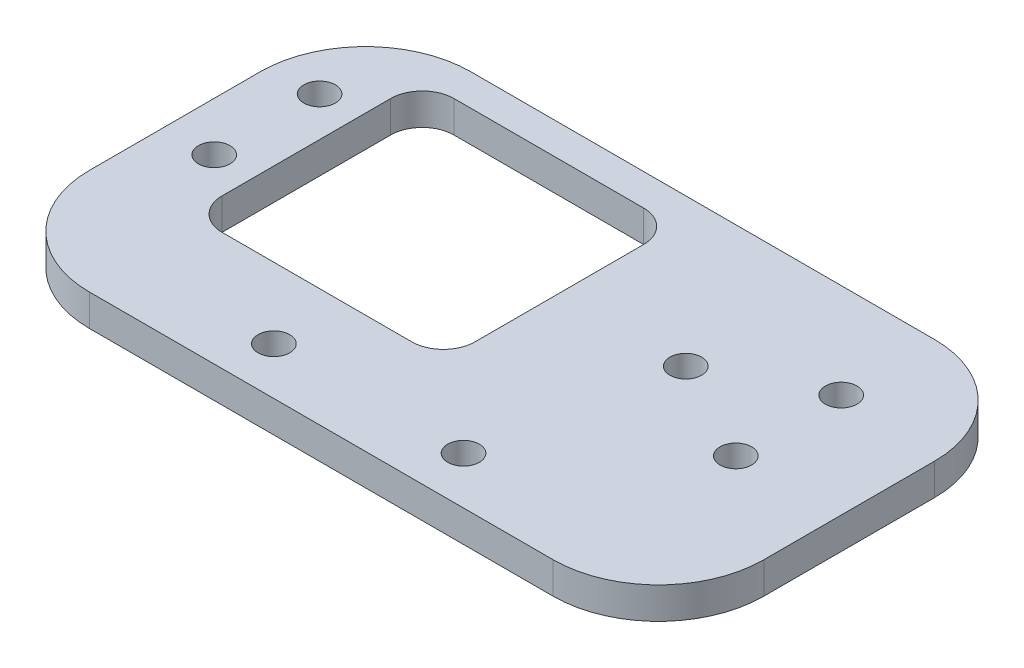
ISO-10303-21;
HEADER;
FILE_DESCRIPTION(('STEP AP214'),'2;1');
FILE_NAME('part.step','',(''),(''),'','','');
FILE_SCHEMA(('AUTOMOTIVE_DESIGN { 1 0 10303 214 1 1 1 1 }'));
ENDSEC;
DATA;
#1=APPLICATION_CONTEXT('core data for automotive mechanical design processes');
#2=APPLICATION_PROTOCOL_DEFINITION('international standard','automotive_design',2000,#1);
#3=PRODUCT_CONTEXT('',#1,'mechanical');
#4=PRODUCT('Part','Part','',(#3));
#5=PRODUCT_RELATED_PRODUCT_CATEGORY('part','',(#4));
#6=PRODUCT_DEFINITION_FORMATION('','',#4);
#7=PRODUCT_DEFINITION_CONTEXT('part definition',#1,'design');
#8=PRODUCT_DEFINITION('design','',#6,#7);
#9=PRODUCT_DEFINITION_SHAPE('','',#8);
#10=(LENGTH_UNIT() NAMED_UNIT(*) SI_UNIT(.MILLI.,.METRE.));
#11=(NAMED_UNIT(*) PLANE_ANGLE_UNIT() SI_UNIT($,.RADIAN.));
#12=(NAMED_UNIT(*) SI_UNIT($,.STERADIAN.) SOLID_ANGLE_UNIT());
#13=UNCERTAINTY_MEASURE_WITH_UNIT(LENGTH_MEASURE(1.E-05),#10,'distance_accuracy_value','');
#14=(GEOMETRIC_REPRESENTATION_CONTEXT(3) GLOBAL_UNCERTAINTY_ASSIGNED_CONTEXT((#13)) GLOBAL_UNIT_ASSIGNED_CONTEXT((#10,
#11,#12)) REPRESENTATION_CONTEXT('',''));
#15=CARTESIAN_POINT('',(0.,0.,0.));
#16=DIRECTION('',(0.,0.,1.));
#17=DIRECTION('',(1.,0.,0.));
#18=AXIS2_PLACEMENT_3D('',#15,#16,#17);
#19=CARTESIAN_POINT('',(0.,3.,0.));
#20=DIRECTION('',(0.,-1.,0.));
#21=DIRECTION('',(0.,0.,-1.));
#22=AXIS2_PLACEMENT_3D('',#19,#20,#21);
#23=PLANE('',#22);
#24=CARTESIAN_POINT('',(12.39,3.,-4.10000000000002));
#25=DIRECTION('',(0.,1.,0.));
#26=DIRECTION('',(0.,0.,1.));
#27=AXIS2_PLACEMENT_3D('',#24,#25,#26);
#28=CIRCLE('',#27,1.5);
#29=CARTESIAN_POINT('',(12.39,3.,-2.60000000000002));
#30=VERTEX_POINT('',#29);
#31=EDGE_CURVE('E398',#30,#30,#28,.T.);
#32=ORIENTED_EDGE('',*,*,#31,.F.);
#33=EDGE_LOOP('',(#32));
#34=FACE_BOUND('',#33,.T.);
#35=DIRECTION('',(-1.,0.,0.));
#36=VECTOR('',#35,1.);
#37=CARTESIAN_POINT('',(-23.61,3.,-15.1));
#38=LINE('',#37,#36);
#39=CARTESIAN_POINT('',(-2.60999999999999,3.,-15.1));
#40=VERTEX_POINT('',#39);
#41=CARTESIAN_POINT('',(-20.61,3.,-15.1));
#42=VERTEX_POINT('',#41);
#43=EDGE_CURVE('E264',#40,#42,#38,.T.);
#44=ORIENTED_EDGE('',*,*,#43,.F.);
#45=CARTESIAN_POINT('',(-2.60999999999998,3.,-12.1));
#46=DIRECTION('',(0.,-1.,0.));
#47=DIRECTION('',(0.,0.,-1.));
#48=AXIS2_PLACEMENT_3D('',#45,#46,#47);
#49=CIRCLE('',#48,3.);
#50=CARTESIAN_POINT('',(0.390000000000019,3.,-12.1));
#51=VERTEX_POINT('',#50);
#52=EDGE_CURVE('E241',#40,#51,#49,.T.);
#53=ORIENTED_EDGE('',*,*,#52,.T.);
#54=DIRECTION('',(0.,0.,1.));
#55=VECTOR('',#54,1.);
#56=CARTESIAN_POINT('',(0.390000000000019,3.,-15.1));
#57=LINE('',#56,#55);
#58=CARTESIAN_POINT('',(0.390000000000021,3.,3.9));
#59=VERTEX_POINT('',#58);
#60=EDGE_CURVE('E387',#51,#59,#57,.T.);
#61=ORIENTED_EDGE('',*,*,#60,.T.);
#62=CARTESIAN_POINT('',(-2.60999999999998,3.,3.9));
#63=DIRECTION('',(0.,-1.,0.));
#64=DIRECTION('',(0.,0.,-1.));
#65=AXIS2_PLACEMENT_3D('',#62,#63,#64);
#66=CIRCLE('',#65,3.);
#67=CARTESIAN_POINT('',(-2.60999999999999,3.,6.9));
#68=VERTEX_POINT('',#67);
#69=EDGE_CURVE('E237',#59,#68,#66,.T.);
#70=ORIENTED_EDGE('',*,*,#69,.T.);
#71=DIRECTION('',(1.,0.,0.));
#72=VECTOR('',#71,1.);
#73=CARTESIAN_POINT('',(-23.61,3.,6.9));
#74=LINE('',#73,#72);
#75=CARTESIAN_POINT('',(-20.61,3.,6.9));
#76=VERTEX_POINT('',#75);
#77=EDGE_CURVE('E269',#76,#68,#74,.T.);
#78=ORIENTED_EDGE('',*,*,#77,.F.);
#79=CARTESIAN_POINT('',(-20.61,3.,3.89999999999999));
#80=DIRECTION('',(0.,-1.,0.));
#81=DIRECTION('',(0.,0.,-1.));
#82=AXIS2_PLACEMENT_3D('',#79,#80,#81);
#83=CIRCLE('',#82,3.);
#84=CARTESIAN_POINT('',(-23.61,3.,3.89999999999999));
#85=VERTEX_POINT('',#84);
#86=EDGE_CURVE('E11',#76,#85,#83,.T.);
#87=ORIENTED_EDGE('',*,*,#86,.T.);
#88=DIRECTION('',(0.,0.,1.));
#89=VECTOR('',#88,1.);
#90=CARTESIAN_POINT('',(-23.61,3.,6.9));
#91=LINE('',#90,#89);
#92=CARTESIAN_POINT('',(-23.61,3.,-12.1));
#93=VERTEX_POINT('',#92);
#94=EDGE_CURVE('E267',#93,#85,#91,.T.);
#95=ORIENTED_EDGE('',*,*,#94,.F.);
#96=CARTESIAN_POINT('',(-20.61,3.,-12.1));
#97=DIRECTION('',(0.,-1.,0.));
#98=DIRECTION('',(0.,0.,-1.));
#99=AXIS2_PLACEMENT_3D('',#96,#97,#98);
#100=CIRCLE('',#99,3.);
#101=EDGE_CURVE('E247',#93,#42,#100,.T.);
#102=ORIENTED_EDGE('',*,*,#101,.T.);
#103=EDGE_LOOP('',(#44,#53,#61,#70,#78,#87,#95,#102));
#104=FACE_BOUND('',#103,.T.);
#105=CARTESIAN_POINT('',(-8.99999999999998,3.,13.6));
#106=DIRECTION('',(0.,1.,0.));
#107=DIRECTION('',(0.,0.,-1.));
#108=AXIS2_PLACEMENT_3D('',#105,#106,#107);
#109=CIRCLE('',#108,1.5);
#110=CARTESIAN_POINT('',(-8.99999999999998,3.,12.1));
#111=VERTEX_POINT('',#110);
#112=EDGE_CURVE('E282',#111,#111,#109,.T.);
#113=ORIENTED_EDGE('',*,*,#112,.F.);
#114=EDGE_LOOP('',(#113));
#115=FACE_BOUND('',#114,.T.);
#116=CARTESIAN_POINT('',(9.00000000000002,3.,13.6));
#117=DIRECTION('',(0.,1.,0.));
#118=DIRECTION('',(0.,0.,1.));
#119=AXIS2_PLACEMENT_3D('',#116,#117,#118);
#120=CIRCLE('',#119,1.5);
#121=CARTESIAN_POINT('',(9.00000000000002,3.,15.1));
#122=VERTEX_POINT('',#121);
#123=EDGE_CURVE('E288',#122,#122,#120,.T.);
#124=ORIENTED_EDGE('',*,*,#123,.F.);
#125=EDGE_LOOP('',(#124));
#126=FACE_BOUND('',#125,.T.);
#127=DIRECTION('',(-1.,0.,0.));
#128=VECTOR('',#127,1.);
#129=CARTESIAN_POINT('',(-32.,3.,-18.1));
#130=LINE('',#129,#128);
#131=CARTESIAN_POINT('',(22.,3.,-18.1));
#132=VERTEX_POINT('',#131);
#133=CARTESIAN_POINT('',(-22.,3.,-18.1));
#134=VERTEX_POINT('',#133);
#135=EDGE_CURVE('E295',#132,#134,#130,.T.);
#136=ORIENTED_EDGE('',*,*,#135,.T.);
#137=CARTESIAN_POINT('',(-22.,3.,-8.1));
#138=DIRECTION('',(0.,-1.,0.));
#139=DIRECTION('',(0.,0.,-1.));
#140=AXIS2_PLACEMENT_3D('',#137,#138,#139);
#141=CIRCLE('',#140,10.);
#142=CARTESIAN_POINT('',(-32.,3.,-8.1));
#143=VERTEX_POINT('',#142);
#144=EDGE_CURVE('E206',#134,#143,#141,.F.);
#145=ORIENTED_EDGE('',*,*,#144,.T.);
#146=DIRECTION('',(0.,0.,1.));
#147=VECTOR('',#146,1.);
#148=CARTESIAN_POINT('',(-32.,3.,18.1));
#149=LINE('',#148,#147);
#150=CARTESIAN_POINT('',(-32.,3.,8.1));
#151=VERTEX_POINT('',#150);
#152=EDGE_CURVE('E174',#143,#151,#149,.T.);
#153=ORIENTED_EDGE('',*,*,#152,.T.);
#154=CARTESIAN_POINT('',(-22.,3.,8.1));
#155=DIRECTION('',(0.,-1.,0.));
#156=DIRECTION('',(0.,0.,-1.));
#157=AXIS2_PLACEMENT_3D('',#154,#155,#156);
#158=CIRCLE('',#157,10.);
#159=CARTESIAN_POINT('',(-22.,3.,18.1));
#160=VERTEX_POINT('',#159);
#161=EDGE_CURVE('E200',#151,#160,#158,.F.);
#162=ORIENTED_EDGE('',*,*,#161,.T.);
#163=DIRECTION('',(1.,0.,0.));
#164=VECTOR('',#163,1.);
#165=CARTESIAN_POINT('',(-32.,3.,18.1));
#166=LINE('',#165,#164);
#167=CARTESIAN_POINT('',(22.,3.,18.1));
#168=VERTEX_POINT('',#167);
#169=EDGE_CURVE('E191',#160,#168,#166,.T.);
#170=ORIENTED_EDGE('',*,*,#169,.T.);
#171=CARTESIAN_POINT('',(22.,3.,8.1));
#172=DIRECTION('',(0.,-1.,0.));
#173=DIRECTION('',(0.,0.,-1.));
#174=AXIS2_PLACEMENT_3D('',#171,#172,#173);
#175=CIRCLE('',#174,10.);
#176=CARTESIAN_POINT('',(32.,3.,8.1));
#177=VERTEX_POINT('',#176);
#178=EDGE_CURVE('E202',#168,#177,#175,.F.);
#179=ORIENTED_EDGE('',*,*,#178,.T.);
#180=DIRECTION('',(0.,0.,-1.));
#181=VECTOR('',#180,1.);
#182=CARTESIAN_POINT('',(32.,3.,18.1));
#183=LINE('',#182,#181);
#184=CARTESIAN_POINT('',(32.,3.,-8.1));
#185=VERTEX_POINT('',#184);
#186=EDGE_CURVE('E185',#177,#185,#183,.T.);
#187=ORIENTED_EDGE('',*,*,#186,.T.);
#188=CARTESIAN_POINT('',(22.,3.,-8.1));
#189=DIRECTION('',(0.,-1.,0.));
#190=DIRECTION('',(0.,0.,-1.));
#191=AXIS2_PLACEMENT_3D('',#188,#189,#190);
#192=CIRCLE('',#191,10.);
#193=EDGE_CURVE('E204',#185,#132,#192,.F.);
#194=ORIENTED_EDGE('',*,*,#193,.T.);
#195=EDGE_LOOP('',(#136,#145,#153,#162,#170,#179,#187,#194));
#196=FACE_BOUND('',#195,.T.);
#197=CARTESIAN_POINT('',(22.14,3.,-9.10000000000002));
#198=DIRECTION('',(0.,1.,0.));
#199=DIRECTION('',(0.,0.,1.));
#200=AXIS2_PLACEMENT_3D('',#197,#198,#199);
#201=CIRCLE('',#200,1.5);
#202=CARTESIAN_POINT('',(22.14,3.,-7.60000000000002));
#203=VERTEX_POINT('',#202);
#204=EDGE_CURVE('E280',#203,#203,#201,.T.);
#205=ORIENTED_EDGE('',*,*,#204,.F.);
#206=EDGE_LOOP('',(#205));
#207=FACE_BOUND('',#206,.T.);
#208=CARTESIAN_POINT('',(22.14,3.,0.899999999999983));
#209=DIRECTION('',(0.,1.,0.));
#210=DIRECTION('',(0.,0.,-1.));
#211=AXIS2_PLACEMENT_3D('',#208,#209,#210);
#212=CIRCLE('',#211,1.5);
#213=CARTESIAN_POINT('',(22.14,3.,-0.600000000000018));
#214=VERTEX_POINT('',#213);
#215=EDGE_CURVE('E414',#214,#214,#212,.T.);
#216=ORIENTED_EDGE('',*,*,#215,.F.);
#217=EDGE_LOOP('',(#216));
#218=FACE_BOUND('',#217,.T.);
#219=CARTESIAN_POINT('',(-27.36,3.,0.899999999999983));
#220=DIRECTION('',(0.,1.,0.));
#221=DIRECTION('',(0.,0.,1.));
#222=AXIS2_PLACEMENT_3D('',#219,#220,#221);
#223=CIRCLE('',#222,1.5);
#224=CARTESIAN_POINT('',(-27.36,3.,2.39999999999999));
#225=VERTEX_POINT('',#224);
#226=EDGE_CURVE('E408',#225,#225,#223,.T.);
#227=ORIENTED_EDGE('',*,*,#226,.F.);
#228=EDGE_LOOP('',(#227));
#229=FACE_BOUND('',#228,.T.);
#230=CARTESIAN_POINT('',(-27.36,3.,-9.10000000000002));
#231=DIRECTION('',(0.,1.,0.));
#232=DIRECTION('',(0.,0.,-1.));
#233=AXIS2_PLACEMENT_3D('',#230,#231,#232);
#234=CIRCLE('',#233,1.5);
#235=CARTESIAN_POINT('',(-27.36,3.,-10.6));
#236=VERTEX_POINT('',#235);
#237=EDGE_CURVE('E402',#236,#236,#234,.T.);
#238=ORIENTED_EDGE('',*,*,#237,.F.);
#239=EDGE_LOOP('',(#238));
#240=FACE_BOUND('',#239,.T.);
#241=ADVANCED_FACE('F41',(#34,#104,#115,#126,#196,#207,#218,#229,#240),#23,.F.);
#242=CARTESIAN_POINT('',(0.,0.,0.));
#243=DIRECTION('',(0.,-1.,0.));
#244=DIRECTION('',(0.,0.,-1.));
#245=AXIS2_PLACEMENT_3D('',#242,#243,#244);
#246=PLANE('',#245);
#247=CARTESIAN_POINT('',(12.39,0.,-4.10000000000002));
#248=DIRECTION('',(0.,1.,0.));
#249=DIRECTION('',(0.,0.,1.));
#250=AXIS2_PLACEMENT_3D('',#247,#248,#249);
#251=CIRCLE('',#250,1.5);
#252=CARTESIAN_POINT('',(12.39,0.,-2.60000000000002));
#253=VERTEX_POINT('',#252);
#254=EDGE_CURVE('E393',#253,#253,#251,.T.);
#255=ORIENTED_EDGE('',*,*,#254,.T.);
#256=EDGE_LOOP('',(#255));
#257=FACE_BOUND('',#256,.T.);
#258=DIRECTION('',(0.,0.,1.));
#259=VECTOR('',#258,1.);
#260=CARTESIAN_POINT('',(0.390000000000019,0.,-15.1));
#261=LINE('',#260,#259);
#262=CARTESIAN_POINT('',(0.390000000000019,0.,-12.1));
#263=VERTEX_POINT('',#262);
#264=CARTESIAN_POINT('',(0.390000000000021,0.,3.9));
#265=VERTEX_POINT('',#264);
#266=EDGE_CURVE('E392',#263,#265,#261,.T.);
#267=ORIENTED_EDGE('',*,*,#266,.F.);
#268=CARTESIAN_POINT('',(-2.60999999999998,0.,-12.1));
#269=DIRECTION('',(0.,-1.,0.));
#270=DIRECTION('',(0.,0.,-1.));
#271=AXIS2_PLACEMENT_3D('',#268,#269,#270);
#272=CIRCLE('',#271,3.);
#273=CARTESIAN_POINT('',(-2.60999999999999,0.,-15.1));
#274=VERTEX_POINT('',#273);
#275=EDGE_CURVE('E243',#263,#274,#272,.F.);
#276=ORIENTED_EDGE('',*,*,#275,.T.);
#277=DIRECTION('',(-1.,0.,0.));
#278=VECTOR('',#277,1.);
#279=CARTESIAN_POINT('',(-23.61,0.,-15.1));
#280=LINE('',#279,#278);
#281=CARTESIAN_POINT('',(-20.61,0.,-15.1));
#282=VERTEX_POINT('',#281);
#283=EDGE_CURVE('E277',#274,#282,#280,.T.);
#284=ORIENTED_EDGE('',*,*,#283,.T.);
#285=CARTESIAN_POINT('',(-20.61,0.,-12.1));
#286=DIRECTION('',(0.,-1.,0.));
#287=DIRECTION('',(0.,0.,-1.));
#288=AXIS2_PLACEMENT_3D('',#285,#286,#287);
#289=CIRCLE('',#288,3.);
#290=CARTESIAN_POINT('',(-23.61,0.,-12.1));
#291=VERTEX_POINT('',#290);
#292=EDGE_CURVE('E245',#282,#291,#289,.F.);
#293=ORIENTED_EDGE('',*,*,#292,.T.);
#294=DIRECTION('',(0.,0.,1.));
#295=VECTOR('',#294,1.);
#296=CARTESIAN_POINT('',(-23.61,0.,6.9));
#297=LINE('',#296,#295);
#298=CARTESIAN_POINT('',(-23.61,0.,3.89999999999999));
#299=VERTEX_POINT('',#298);
#300=EDGE_CURVE('E256',#291,#299,#297,.T.);
#301=ORIENTED_EDGE('',*,*,#300,.T.);
#302=CARTESIAN_POINT('',(-20.61,0.,3.89999999999999));
#303=DIRECTION('',(0.,-1.,0.));
#304=DIRECTION('',(0.,0.,-1.));
#305=AXIS2_PLACEMENT_3D('',#302,#303,#304);
#306=CIRCLE('',#305,3.);
#307=CARTESIAN_POINT('',(-20.61,0.,6.9));
#308=VERTEX_POINT('',#307);
#309=EDGE_CURVE('E49',#299,#308,#306,.F.);
#310=ORIENTED_EDGE('',*,*,#309,.T.);
#311=DIRECTION('',(1.,0.,0.));
#312=VECTOR('',#311,1.);
#313=CARTESIAN_POINT('',(-23.61,0.,6.9));
#314=LINE('',#313,#312);
#315=CARTESIAN_POINT('',(-2.60999999999999,0.,6.9));
#316=VERTEX_POINT('',#315);
#317=EDGE_CURVE('E254',#308,#316,#314,.T.);
#318=ORIENTED_EDGE('',*,*,#317,.T.);
#319=CARTESIAN_POINT('',(-2.60999999999998,0.,3.9));
#320=DIRECTION('',(0.,-1.,0.));
#321=DIRECTION('',(0.,0.,-1.));
#322=AXIS2_PLACEMENT_3D('',#319,#320,#321);
#323=CIRCLE('',#322,3.);
#324=EDGE_CURVE('E239',#316,#265,#323,.F.);
#325=ORIENTED_EDGE('',*,*,#324,.T.);
#326=EDGE_LOOP('',(#267,#276,#284,#293,#301,#310,#318,#325));
#327=FACE_BOUND('',#326,.T.);
#328=CARTESIAN_POINT('',(-27.36,0.,0.899999999999983));
#329=DIRECTION('',(0.,1.,0.));
#330=DIRECTION('',(0.,0.,1.));
#331=AXIS2_PLACEMENT_3D('',#328,#329,#330);
#332=CIRCLE('',#331,1.5);
#333=CARTESIAN_POINT('',(-27.36,0.,2.39999999999999));
#334=VERTEX_POINT('',#333);
#335=EDGE_CURVE('E405',#334,#334,#332,.T.);
#336=ORIENTED_EDGE('',*,*,#335,.T.);
#337=EDGE_LOOP('',(#336));
#338=FACE_BOUND('',#337,.T.);
#339=CARTESIAN_POINT('',(22.14,0.,-9.10000000000002));
#340=DIRECTION('',(0.,1.,0.));
#341=DIRECTION('',(0.,0.,1.));
#342=AXIS2_PLACEMENT_3D('',#339,#340,#341);
#343=CIRCLE('',#342,1.5);
#344=CARTESIAN_POINT('',(22.14,0.,-7.60000000000002));
#345=VERTEX_POINT('',#344);
#346=EDGE_CURVE('E417',#345,#345,#343,.T.);
#347=ORIENTED_EDGE('',*,*,#346,.T.);
#348=EDGE_LOOP('',(#347));
#349=FACE_BOUND('',#348,.T.);
#350=CARTESIAN_POINT('',(9.00000000000002,0.,13.6));
#351=DIRECTION('',(0.,1.,0.));
#352=DIRECTION('',(0.,0.,1.));
#353=AXIS2_PLACEMENT_3D('',#350,#351,#352);
#354=CIRCLE('',#353,1.5);
#355=CARTESIAN_POINT('',(9.00000000000002,0.,15.1));
#356=VERTEX_POINT('',#355);
#357=EDGE_CURVE('E285',#356,#356,#354,.T.);
#358=ORIENTED_EDGE('',*,*,#357,.T.);
#359=EDGE_LOOP('',(#358));
#360=FACE_BOUND('',#359,.T.);
#361=DIRECTION('',(0.,0.,1.));
#362=VECTOR('',#361,1.);
#363=CARTESIAN_POINT('',(-32.,0.,18.1));
#364=LINE('',#363,#362);
#365=CARTESIAN_POINT('',(-32.,0.,-8.1));
#366=VERTEX_POINT('',#365);
#367=CARTESIAN_POINT('',(-32.,0.,8.1));
#368=VERTEX_POINT('',#367);
#369=EDGE_CURVE('E171',#366,#368,#364,.T.);
#370=ORIENTED_EDGE('',*,*,#369,.F.);
#371=CARTESIAN_POINT('',(-22.,0.,-8.1));
#372=DIRECTION('',(0.,-1.,0.));
#373=DIRECTION('',(0.,0.,-1.));
#374=AXIS2_PLACEMENT_3D('',#371,#372,#373);
#375=CIRCLE('',#374,10.);
#376=CARTESIAN_POINT('',(-22.,0.,-18.1));
#377=VERTEX_POINT('',#376);
#378=EDGE_CURVE('E154',#366,#377,#375,.T.);
#379=ORIENTED_EDGE('',*,*,#378,.T.);
#380=DIRECTION('',(-1.,0.,0.));
#381=VECTOR('',#380,1.);
#382=CARTESIAN_POINT('',(-32.,0.,-18.1));
#383=LINE('',#382,#381);
#384=CARTESIAN_POINT('',(22.,0.,-18.1));
#385=VERTEX_POINT('',#384);
#386=EDGE_CURVE('E182',#385,#377,#383,.T.);
#387=ORIENTED_EDGE('',*,*,#386,.F.);
#388=CARTESIAN_POINT('',(22.,0.,-8.1));
#389=DIRECTION('',(0.,-1.,0.));
#390=DIRECTION('',(0.,0.,-1.));
#391=AXIS2_PLACEMENT_3D('',#388,#389,#390);
#392=CIRCLE('',#391,10.);
#393=CARTESIAN_POINT('',(32.,0.,-8.1));
#394=VERTEX_POINT('',#393);
#395=EDGE_CURVE('E165',#385,#394,#392,.T.);
#396=ORIENTED_EDGE('',*,*,#395,.T.);
#397=DIRECTION('',(0.,0.,-1.));
#398=VECTOR('',#397,1.);
#399=CARTESIAN_POINT('',(32.,0.,18.1));
#400=LINE('',#399,#398);
#401=CARTESIAN_POINT('',(32.,0.,8.1));
#402=VERTEX_POINT('',#401);
#403=EDGE_CURVE('E187',#402,#394,#400,.T.);
#404=ORIENTED_EDGE('',*,*,#403,.F.);
#405=CARTESIAN_POINT('',(22.,0.,8.1));
#406=DIRECTION('',(0.,-1.,0.));
#407=DIRECTION('',(0.,0.,-1.));
#408=AXIS2_PLACEMENT_3D('',#405,#406,#407);
#409=CIRCLE('',#408,10.);
#410=CARTESIAN_POINT('',(22.,0.,18.1));
#411=VERTEX_POINT('',#410);
#412=EDGE_CURVE('E194',#402,#411,#409,.T.);
#413=ORIENTED_EDGE('',*,*,#412,.T.);
#414=DIRECTION('',(1.,0.,0.));
#415=VECTOR('',#414,1.);
#416=CARTESIAN_POINT('',(-32.,0.,18.1));
#417=LINE('',#416,#415);
#418=CARTESIAN_POINT('',(-22.,0.,18.1));
#419=VERTEX_POINT('',#418);
#420=EDGE_CURVE('E181',#419,#411,#417,.T.);
#421=ORIENTED_EDGE('',*,*,#420,.F.);
#422=CARTESIAN_POINT('',(-22.,0.,8.1));
#423=DIRECTION('',(0.,-1.,0.));
#424=DIRECTION('',(0.,0.,-1.));
#425=AXIS2_PLACEMENT_3D('',#422,#423,#424);
#426=CIRCLE('',#425,10.);
#427=EDGE_CURVE('E175',#419,#368,#426,.T.);
#428=ORIENTED_EDGE('',*,*,#427,.T.);
#429=EDGE_LOOP('',(#370,#379,#387,#396,#404,#413,#421,#428));
#430=FACE_BOUND('',#429,.T.);
#431=CARTESIAN_POINT('',(-8.99999999999998,0.,13.6));
#432=DIRECTION('',(0.,1.,0.));
#433=DIRECTION('',(0.,0.,-1.));
#434=AXIS2_PLACEMENT_3D('',#431,#432,#433);
#435=CIRCLE('',#434,1.5);
#436=CARTESIAN_POINT('',(-8.99999999999998,0.,12.1));
#437=VERTEX_POINT('',#436);
#438=EDGE_CURVE('E271',#437,#437,#435,.T.);
#439=ORIENTED_EDGE('',*,*,#438,.T.);
#440=EDGE_LOOP('',(#439));
#441=FACE_BOUND('',#440,.T.);
#442=CARTESIAN_POINT('',(22.14,0.,0.899999999999983));
#443=DIRECTION('',(0.,1.,0.));
#444=DIRECTION('',(0.,0.,-1.));
#445=AXIS2_PLACEMENT_3D('',#442,#443,#444);
#446=CIRCLE('',#445,1.5);
#447=CARTESIAN_POINT('',(22.14,0.,-0.600000000000018));
#448=VERTEX_POINT('',#447);
#449=EDGE_CURVE('E411',#448,#448,#446,.T.);
#450=ORIENTED_EDGE('',*,*,#449,.T.);
#451=EDGE_LOOP('',(#450));
#452=FACE_BOUND('',#451,.T.);
#453=CARTESIAN_POINT('',(-27.36,0.,-9.10000000000002));
#454=DIRECTION('',(0.,1.,0.));
#455=DIRECTION('',(0.,0.,-1.));
#456=AXIS2_PLACEMENT_3D('',#453,#454,#455);
#457=CIRCLE('',#456,1.5);
#458=CARTESIAN_POINT('',(-27.36,0.,-10.6));
#459=VERTEX_POINT('',#458);
#460=EDGE_CURVE('E395',#459,#459,#457,.T.);
#461=ORIENTED_EDGE('',*,*,#460,.T.);
#462=EDGE_LOOP('',(#461));
#463=FACE_BOUND('',#462,.T.);
#464=ADVANCED_FACE('F178',(#257,#327,#338,#349,#360,#430,#441,#452,#463),#246,.T.);
#465=CARTESIAN_POINT('',(32.,3.,18.1));
#466=DIRECTION('',(-1.,0.,0.));
#467=DIRECTION('',(0.,0.,1.));
#468=AXIS2_PLACEMENT_3D('',#465,#466,#467);
#469=PLANE('',#468);
#470=ORIENTED_EDGE('',*,*,#403,.T.);
#471=DIRECTION('',(0.,-1.,0.));
#472=VECTOR('',#471,1.);
#473=CARTESIAN_POINT('',(32.,3.,-8.1));
#474=LINE('',#473,#472);
#475=EDGE_CURVE('E211',#394,#185,#474,.F.);
#476=ORIENTED_EDGE('',*,*,#475,.T.);
#477=ORIENTED_EDGE('',*,*,#186,.F.);
#478=DIRECTION('',(0.,-1.,0.));
#479=VECTOR('',#478,1.);
#480=CARTESIAN_POINT('',(32.,3.,8.1));
#481=LINE('',#480,#479);
#482=EDGE_CURVE('E208',#177,#402,#481,.T.);
#483=ORIENTED_EDGE('',*,*,#482,.T.);
#484=EDGE_LOOP('',(#470,#476,#477,#483));
#485=FACE_BOUND('',#484,.T.);
#486=ADVANCED_FACE('F304',(#485),#469,.F.);
#487=CARTESIAN_POINT('',(-32.,3.,-18.1));
#488=DIRECTION('',(0.,0.,1.));
#489=DIRECTION('',(1.,0.,0.));
#490=AXIS2_PLACEMENT_3D('',#487,#488,#489);
#491=PLANE('',#490);
#492=ORIENTED_EDGE('',*,*,#386,.T.);
#493=DIRECTION('',(0.,-1.,0.));
#494=VECTOR('',#493,1.);
#495=CARTESIAN_POINT('',(-22.,3.,-18.1));
#496=LINE('',#495,#494);
#497=EDGE_CURVE('E159',#377,#134,#496,.F.);
#498=ORIENTED_EDGE('',*,*,#497,.T.);
#499=ORIENTED_EDGE('',*,*,#135,.F.);
#500=DIRECTION('',(0.,-1.,0.));
#501=VECTOR('',#500,1.);
#502=CARTESIAN_POINT('',(22.,3.,-18.1));
#503=LINE('',#502,#501);
#504=EDGE_CURVE('E164',#132,#385,#503,.T.);
#505=ORIENTED_EDGE('',*,*,#504,.T.);
#506=EDGE_LOOP('',(#492,#498,#499,#505));
#507=FACE_BOUND('',#506,.T.);
#508=ADVANCED_FACE('F315',(#507),#491,.F.);
#509=CARTESIAN_POINT('',(-32.,3.,18.1));
#510=DIRECTION('',(1.,0.,0.));
#511=DIRECTION('',(0.,0.,-1.));
#512=AXIS2_PLACEMENT_3D('',#509,#510,#511);
#513=PLANE('',#512);
#514=ORIENTED_EDGE('',*,*,#152,.F.);
#515=DIRECTION('',(0.,-1.,0.));
#516=VECTOR('',#515,1.);
#517=CARTESIAN_POINT('',(-32.,3.,-8.1));
#518=LINE('',#517,#516);
#519=EDGE_CURVE('E158',#143,#366,#518,.T.);
#520=ORIENTED_EDGE('',*,*,#519,.T.);
#521=ORIENTED_EDGE('',*,*,#369,.T.);
#522=DIRECTION('',(0.,-1.,0.));
#523=VECTOR('',#522,1.);
#524=CARTESIAN_POINT('',(-32.,3.,8.1));
#525=LINE('',#524,#523);
#526=EDGE_CURVE('E176',#368,#151,#525,.F.);
#527=ORIENTED_EDGE('',*,*,#526,.T.);
#528=EDGE_LOOP('',(#514,#520,#521,#527));
#529=FACE_BOUND('',#528,.T.);
#530=ADVANCED_FACE('F170',(#529),#513,.F.);
#531=CARTESIAN_POINT('',(-32.,3.,18.1));
#532=DIRECTION('',(0.,0.,-1.));
#533=DIRECTION('',(-1.,0.,0.));
#534=AXIS2_PLACEMENT_3D('',#531,#532,#533);
#535=PLANE('',#534);
#536=ORIENTED_EDGE('',*,*,#420,.T.);
#537=DIRECTION('',(0.,-1.,0.));
#538=VECTOR('',#537,1.);
#539=CARTESIAN_POINT('',(22.,3.,18.1));
#540=LINE('',#539,#538);
#541=EDGE_CURVE('E216',#411,#168,#540,.F.);
#542=ORIENTED_EDGE('',*,*,#541,.T.);
#543=ORIENTED_EDGE('',*,*,#169,.F.);
#544=DIRECTION('',(0.,-1.,0.));
#545=VECTOR('',#544,1.);
#546=CARTESIAN_POINT('',(-22.,3.,18.1));
#547=LINE('',#546,#545);
#548=EDGE_CURVE('E213',#160,#419,#547,.T.);
#549=ORIENTED_EDGE('',*,*,#548,.T.);
#550=EDGE_LOOP('',(#536,#542,#543,#549));
#551=FACE_BOUND('',#550,.T.);
#552=ADVANCED_FACE('F322',(#551),#535,.F.);
#553=CARTESIAN_POINT('',(9.00000000000002,3.,13.6));
#554=DIRECTION('',(0.,-1.,0.));
#555=DIRECTION('',(0.,0.,-1.));
#556=AXIS2_PLACEMENT_3D('',#553,#554,#555);
#557=CYLINDRICAL_SURFACE('',#556,1.5);
#558=ORIENTED_EDGE('',*,*,#123,.T.);
#559=EDGE_LOOP('',(#558));
#560=FACE_BOUND('',#559,.T.);
#561=ORIENTED_EDGE('',*,*,#357,.F.);
#562=EDGE_LOOP('',(#561));
#563=FACE_BOUND('',#562,.T.);
#564=ADVANCED_FACE('F336',(#560,#563),#557,.F.);
#565=CARTESIAN_POINT('',(-8.99999999999998,3.,13.6));
#566=DIRECTION('',(0.,-1.,0.));
#567=DIRECTION('',(0.,0.,-1.));
#568=AXIS2_PLACEMENT_3D('',#565,#566,#567);
#569=CYLINDRICAL_SURFACE('',#568,1.5);
#570=ORIENTED_EDGE('',*,*,#112,.T.);
#571=EDGE_LOOP('',(#570));
#572=FACE_BOUND('',#571,.T.);
#573=ORIENTED_EDGE('',*,*,#438,.F.);
#574=EDGE_LOOP('',(#573));
#575=FACE_BOUND('',#574,.T.);
#576=ADVANCED_FACE('F345',(#572,#575),#569,.F.);
#577=CARTESIAN_POINT('',(-23.61,3.,-15.1));
#578=DIRECTION('',(0.,0.,1.));
#579=DIRECTION('',(1.,0.,0.));
#580=AXIS2_PLACEMENT_3D('',#577,#578,#579);
#581=PLANE('',#580);
#582=ORIENTED_EDGE('',*,*,#283,.F.);
#583=DIRECTION('',(0.,1.,0.));
#584=VECTOR('',#583,1.);
#585=CARTESIAN_POINT('',(-2.60999999999998,3.,-15.1));
#586=LINE('',#585,#584);
#587=EDGE_CURVE('E230',#274,#40,#586,.T.);
#588=ORIENTED_EDGE('',*,*,#587,.T.);
#589=ORIENTED_EDGE('',*,*,#43,.T.);
#590=DIRECTION('',(0.,-1.,0.));
#591=VECTOR('',#590,1.);
#592=CARTESIAN_POINT('',(-20.61,0.,-15.1));
#593=LINE('',#592,#591);
#594=EDGE_CURVE('E227',#42,#282,#593,.T.);
#595=ORIENTED_EDGE('',*,*,#594,.T.);
#596=EDGE_LOOP('',(#582,#588,#589,#595));
#597=FACE_BOUND('',#596,.T.);
#598=ADVANCED_FACE('F381',(#597),#581,.T.);
#599=CARTESIAN_POINT('',(-23.61,3.,6.9));
#600=DIRECTION('',(1.,0.,0.));
#601=DIRECTION('',(0.,0.,-1.));
#602=AXIS2_PLACEMENT_3D('',#599,#600,#601);
#603=PLANE('',#602);
#604=ORIENTED_EDGE('',*,*,#300,.F.);
#605=DIRECTION('',(0.,-1.,0.));
#606=VECTOR('',#605,1.);
#607=CARTESIAN_POINT('',(-23.61,3.,-12.1));
#608=LINE('',#607,#606);
#609=EDGE_CURVE('E61',#291,#93,#608,.F.);
#610=ORIENTED_EDGE('',*,*,#609,.T.);
#611=ORIENTED_EDGE('',*,*,#94,.T.);
#612=DIRECTION('',(0.,-1.,0.));
#613=VECTOR('',#612,1.);
#614=CARTESIAN_POINT('',(-23.61,0.,3.89999999999999));
#615=LINE('',#614,#613);
#616=EDGE_CURVE('E233',#85,#299,#615,.T.);
#617=ORIENTED_EDGE('',*,*,#616,.T.);
#618=EDGE_LOOP('',(#604,#610,#611,#617));
#619=FACE_BOUND('',#618,.T.);
#620=ADVANCED_FACE('F266',(#619),#603,.T.);
#621=CARTESIAN_POINT('',(-23.61,3.,6.9));
#622=DIRECTION('',(0.,0.,-1.));
#623=DIRECTION('',(-1.,0.,0.));
#624=AXIS2_PLACEMENT_3D('',#621,#622,#623);
#625=PLANE('',#624);
#626=ORIENTED_EDGE('',*,*,#77,.T.);
#627=DIRECTION('',(0.,1.,0.));
#628=VECTOR('',#627,1.);
#629=CARTESIAN_POINT('',(-2.60999999999998,0.,6.9));
#630=LINE('',#629,#628);
#631=EDGE_CURVE('E225',#68,#316,#630,.F.);
#632=ORIENTED_EDGE('',*,*,#631,.T.);
#633=ORIENTED_EDGE('',*,*,#317,.F.);
#634=DIRECTION('',(0.,-1.,0.));
#635=VECTOR('',#634,1.);
#636=CARTESIAN_POINT('',(-20.61,3.,6.9));
#637=LINE('',#636,#635);
#638=EDGE_CURVE('E223',#308,#76,#637,.F.);
#639=ORIENTED_EDGE('',*,*,#638,.T.);
#640=EDGE_LOOP('',(#626,#632,#633,#639));
#641=FACE_BOUND('',#640,.T.);
#642=ADVANCED_FACE('F262',(#641),#625,.T.);
#643=CARTESIAN_POINT('',(22.14,3.,-9.10000000000002));
#644=DIRECTION('',(0.,-1.,0.));
#645=DIRECTION('',(0.,0.,-1.));
#646=AXIS2_PLACEMENT_3D('',#643,#644,#645);
#647=CYLINDRICAL_SURFACE('',#646,1.5);
#648=ORIENTED_EDGE('',*,*,#204,.T.);
#649=EDGE_LOOP('',(#648));
#650=FACE_BOUND('',#649,.T.);
#651=ORIENTED_EDGE('',*,*,#346,.F.);
#652=EDGE_LOOP('',(#651));
#653=FACE_BOUND('',#652,.T.);
#654=ADVANCED_FACE('F426',(#650,#653),#647,.F.);
#655=CARTESIAN_POINT('',(22.14,3.,0.899999999999983));
#656=DIRECTION('',(0.,-1.,0.));
#657=DIRECTION('',(0.,0.,-1.));
#658=AXIS2_PLACEMENT_3D('',#655,#656,#657);
#659=CYLINDRICAL_SURFACE('',#658,1.5);
#660=ORIENTED_EDGE('',*,*,#215,.T.);
#661=EDGE_LOOP('',(#660));
#662=FACE_BOUND('',#661,.T.);
#663=ORIENTED_EDGE('',*,*,#449,.F.);
#664=EDGE_LOOP('',(#663));
#665=FACE_BOUND('',#664,.T.);
#666=ADVANCED_FACE('F428',(#662,#665),#659,.F.);
#667=CARTESIAN_POINT('',(-27.36,3.,0.899999999999983));
#668=DIRECTION('',(0.,-1.,0.));
#669=DIRECTION('',(0.,0.,-1.));
#670=AXIS2_PLACEMENT_3D('',#667,#668,#669);
#671=CYLINDRICAL_SURFACE('',#670,1.5);
#672=ORIENTED_EDGE('',*,*,#226,.T.);
#673=EDGE_LOOP('',(#672));
#674=FACE_BOUND('',#673,.T.);
#675=ORIENTED_EDGE('',*,*,#335,.F.);
#676=EDGE_LOOP('',(#675));
#677=FACE_BOUND('',#676,.T.);
#678=ADVANCED_FACE('F435',(#674,#677),#671,.F.);
#679=CARTESIAN_POINT('',(-27.36,3.,-9.10000000000002));
#680=DIRECTION('',(0.,-1.,0.));
#681=DIRECTION('',(0.,0.,-1.));
#682=AXIS2_PLACEMENT_3D('',#679,#680,#681);
#683=CYLINDRICAL_SURFACE('',#682,1.5);
#684=ORIENTED_EDGE('',*,*,#237,.T.);
#685=EDGE_LOOP('',(#684));
#686=FACE_BOUND('',#685,.T.);
#687=ORIENTED_EDGE('',*,*,#460,.F.);
#688=EDGE_LOOP('',(#687));
#689=FACE_BOUND('',#688,.T.);
#690=ADVANCED_FACE('F456',(#686,#689),#683,.F.);
#691=CARTESIAN_POINT('',(0.390000000000019,0.,-15.1));
#692=DIRECTION('',(-1.,0.,0.));
#693=DIRECTION('',(0.,0.,1.));
#694=AXIS2_PLACEMENT_3D('',#691,#692,#693);
#695=PLANE('',#694);
#696=ORIENTED_EDGE('',*,*,#266,.T.);
#697=DIRECTION('',(0.,1.,0.));
#698=VECTOR('',#697,1.);
#699=CARTESIAN_POINT('',(0.390000000000021,3.,3.9));
#700=LINE('',#699,#698);
#701=EDGE_CURVE('E220',#265,#59,#700,.T.);
#702=ORIENTED_EDGE('',*,*,#701,.T.);
#703=ORIENTED_EDGE('',*,*,#60,.F.);
#704=DIRECTION('',(0.,1.,0.));
#705=VECTOR('',#704,1.);
#706=CARTESIAN_POINT('',(0.390000000000019,0.,-12.1));
#707=LINE('',#706,#705);
#708=EDGE_CURVE('E218',#51,#263,#707,.F.);
#709=ORIENTED_EDGE('',*,*,#708,.T.);
#710=EDGE_LOOP('',(#696,#702,#703,#709));
#711=FACE_BOUND('',#710,.T.);
#712=ADVANCED_FACE('F390',(#711),#695,.T.);
#713=CARTESIAN_POINT('',(12.39,0.,-4.10000000000002));
#714=DIRECTION('',(0.,1.,0.));
#715=DIRECTION('',(0.,0.,1.));
#716=AXIS2_PLACEMENT_3D('',#713,#714,#715);
#717=CYLINDRICAL_SURFACE('',#716,1.5);
#718=ORIENTED_EDGE('',*,*,#254,.F.);
#719=EDGE_LOOP('',(#718));
#720=FACE_BOUND('',#719,.T.);
#721=ORIENTED_EDGE('',*,*,#31,.T.);
#722=EDGE_LOOP('',(#721));
#723=FACE_BOUND('',#722,.T.);
#724=ADVANCED_FACE('F465',(#720,#723),#717,.F.);
#725=CARTESIAN_POINT('',(-22.,3.,-8.1));
#726=DIRECTION('',(0.,-1.,0.));
#727=DIRECTION('',(0.,0.,-1.));
#728=AXIS2_PLACEMENT_3D('',#725,#726,#727);
#729=CYLINDRICAL_SURFACE('',#728,10.);
#730=ORIENTED_EDGE('',*,*,#144,.F.);
#731=ORIENTED_EDGE('',*,*,#497,.F.);
#732=ORIENTED_EDGE('',*,*,#378,.F.);
#733=ORIENTED_EDGE('',*,*,#519,.F.);
#734=EDGE_LOOP('',(#730,#731,#732,#733));
#735=FACE_BOUND('',#734,.T.);
#736=ADVANCED_FACE('F157',(#735),#729,.T.);
#737=CARTESIAN_POINT('',(22.,3.,-8.1));
#738=DIRECTION('',(0.,-1.,0.));
#739=DIRECTION('',(0.,0.,-1.));
#740=AXIS2_PLACEMENT_3D('',#737,#738,#739);
#741=CYLINDRICAL_SURFACE('',#740,10.);
#742=ORIENTED_EDGE('',*,*,#193,.F.);
#743=ORIENTED_EDGE('',*,*,#475,.F.);
#744=ORIENTED_EDGE('',*,*,#395,.F.);
#745=ORIENTED_EDGE('',*,*,#504,.F.);
#746=EDGE_LOOP('',(#742,#743,#744,#745));
#747=FACE_BOUND('',#746,.T.);
#748=ADVANCED_FACE('F309',(#747),#741,.T.);
#749=CARTESIAN_POINT('',(22.,3.,8.1));
#750=DIRECTION('',(0.,-1.,0.));
#751=DIRECTION('',(0.,0.,-1.));
#752=AXIS2_PLACEMENT_3D('',#749,#750,#751);
#753=CYLINDRICAL_SURFACE('',#752,10.);
#754=ORIENTED_EDGE('',*,*,#178,.F.);
#755=ORIENTED_EDGE('',*,*,#541,.F.);
#756=ORIENTED_EDGE('',*,*,#412,.F.);
#757=ORIENTED_EDGE('',*,*,#482,.F.);
#758=EDGE_LOOP('',(#754,#755,#756,#757));
#759=FACE_BOUND('',#758,.T.);
#760=ADVANCED_FACE('F352',(#759),#753,.T.);
#761=CARTESIAN_POINT('',(-22.,3.,8.1));
#762=DIRECTION('',(0.,-1.,0.));
#763=DIRECTION('',(0.,0.,-1.));
#764=AXIS2_PLACEMENT_3D('',#761,#762,#763);
#765=CYLINDRICAL_SURFACE('',#764,10.);
#766=ORIENTED_EDGE('',*,*,#161,.F.);
#767=ORIENTED_EDGE('',*,*,#526,.F.);
#768=ORIENTED_EDGE('',*,*,#427,.F.);
#769=ORIENTED_EDGE('',*,*,#548,.F.);
#770=EDGE_LOOP('',(#766,#767,#768,#769));
#771=FACE_BOUND('',#770,.T.);
#772=ADVANCED_FACE('F355',(#771),#765,.T.);
#773=CARTESIAN_POINT('',(-2.60999999999998,0.,3.9));
#774=DIRECTION('',(0.,-1.,0.));
#775=DIRECTION('',(0.,0.,-1.));
#776=AXIS2_PLACEMENT_3D('',#773,#774,#775);
#777=CYLINDRICAL_SURFACE('',#776,3.);
#778=ORIENTED_EDGE('',*,*,#324,.F.);
#779=ORIENTED_EDGE('',*,*,#631,.F.);
#780=ORIENTED_EDGE('',*,*,#69,.F.);
#781=ORIENTED_EDGE('',*,*,#701,.F.);
#782=EDGE_LOOP('',(#778,#779,#780,#781));
#783=FACE_BOUND('',#782,.T.);
#784=ADVANCED_FACE('F356',(#783),#777,.F.);
#785=CARTESIAN_POINT('',(-2.60999999999998,3.,-12.1));
#786=DIRECTION('',(0.,-1.,0.));
#787=DIRECTION('',(0.,0.,-1.));
#788=AXIS2_PLACEMENT_3D('',#785,#786,#787);
#789=CYLINDRICAL_SURFACE('',#788,3.);
#790=ORIENTED_EDGE('',*,*,#275,.F.);
#791=ORIENTED_EDGE('',*,*,#708,.F.);
#792=ORIENTED_EDGE('',*,*,#52,.F.);
#793=ORIENTED_EDGE('',*,*,#587,.F.);
#794=EDGE_LOOP('',(#790,#791,#792,#793));
#795=FACE_BOUND('',#794,.T.);
#796=ADVANCED_FACE('F362',(#795),#789,.F.);
#797=CARTESIAN_POINT('',(-20.61,3.,-12.1));
#798=DIRECTION('',(0.,1.,0.));
#799=DIRECTION('',(0.,0.,1.));
#800=AXIS2_PLACEMENT_3D('',#797,#798,#799);
#801=CYLINDRICAL_SURFACE('',#800,3.);
#802=ORIENTED_EDGE('',*,*,#101,.F.);
#803=ORIENTED_EDGE('',*,*,#609,.F.);
#804=ORIENTED_EDGE('',*,*,#292,.F.);
#805=ORIENTED_EDGE('',*,*,#594,.F.);
#806=EDGE_LOOP('',(#802,#803,#804,#805));
#807=FACE_BOUND('',#806,.T.);
#808=ADVANCED_FACE('F369',(#807),#801,.F.);
#809=CARTESIAN_POINT('',(-20.61,3.,3.89999999999999));
#810=DIRECTION('',(0.,1.,0.));
#811=DIRECTION('',(0.,0.,1.));
#812=AXIS2_PLACEMENT_3D('',#809,#810,#811);
#813=CYLINDRICAL_SURFACE('',#812,3.);
#814=ORIENTED_EDGE('',*,*,#86,.F.);
#815=ORIENTED_EDGE('',*,*,#638,.F.);
#816=ORIENTED_EDGE('',*,*,#309,.F.);
#817=ORIENTED_EDGE('',*,*,#616,.F.);
#818=EDGE_LOOP('',(#814,#815,#816,#817));
#819=FACE_BOUND('',#818,.T.);
#820=ADVANCED_FACE('F43',(#819),#813,.F.);
#821=CLOSED_SHELL('',(#241,#464,#486,#508,#530,#552,#564,#576,#598,#620,#642,#654,#666,#678,
#690,#712,#724,#736,#748,#760,#772,#784,#796,#808,#820));
#822=MANIFOLD_SOLID_BREP('B2',#821);
#823=ADVANCED_BREP_SHAPE_REPRESENTATION('',(#18,#822),#14);
#824=SHAPE_DEFINITION_REPRESENTATION(#9,#823);
ENDSEC;
END-ISO-10303-21;
